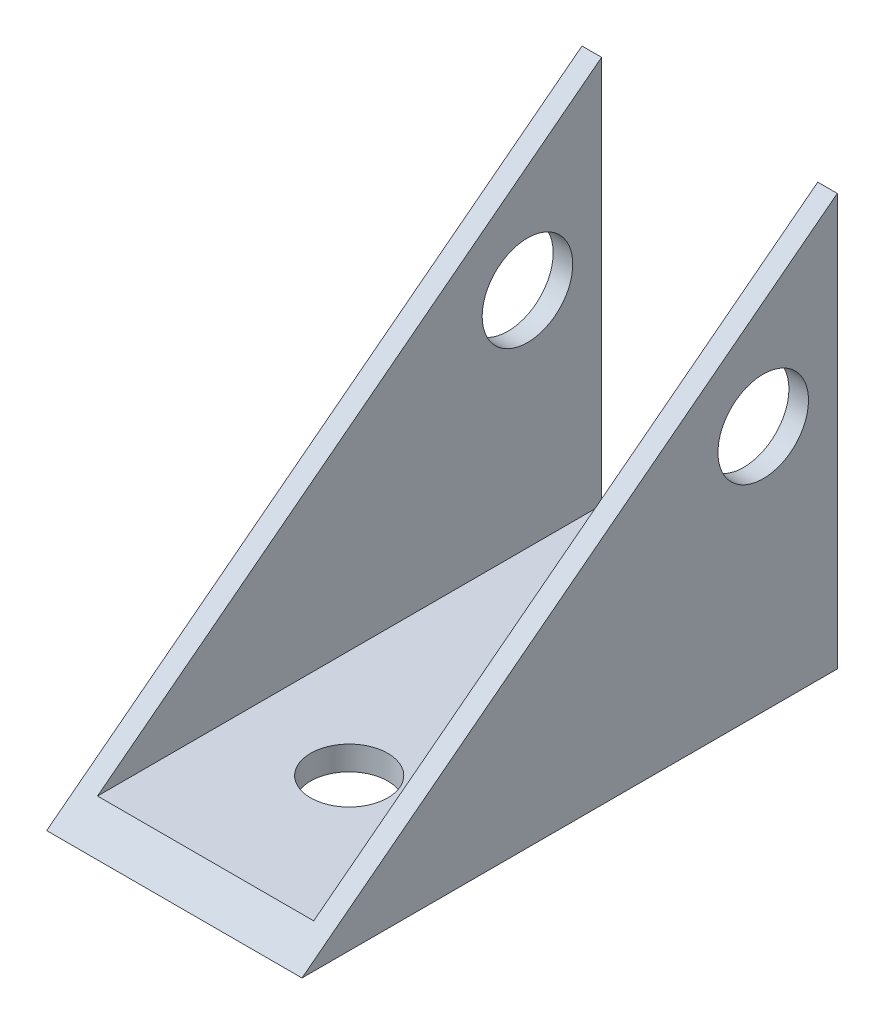
ISO-10303-21;
HEADER;
FILE_DESCRIPTION(('STEP AP214'),'2;1');
FILE_NAME('part.step','',(''),(''),'','','');
FILE_SCHEMA(('AUTOMOTIVE_DESIGN { 1 0 10303 214 1 1 1 1 }'));
ENDSEC;
DATA;
#1=APPLICATION_CONTEXT('core data for automotive mechanical design processes');
#2=APPLICATION_PROTOCOL_DEFINITION('international standard','automotive_design',2000,#1);
#3=PRODUCT_CONTEXT('',#1,'mechanical');
#4=PRODUCT('Part','Part','',(#3));
#5=PRODUCT_RELATED_PRODUCT_CATEGORY('part','',(#4));
#6=PRODUCT_DEFINITION_FORMATION('','',#4);
#7=PRODUCT_DEFINITION_CONTEXT('part definition',#1,'design');
#8=PRODUCT_DEFINITION('design','',#6,#7);
#9=PRODUCT_DEFINITION_SHAPE('','',#8);
#10=(LENGTH_UNIT() NAMED_UNIT(*) SI_UNIT(.MILLI.,.METRE.));
#11=(NAMED_UNIT(*) PLANE_ANGLE_UNIT() SI_UNIT($,.RADIAN.));
#12=(NAMED_UNIT(*) SI_UNIT($,.STERADIAN.) SOLID_ANGLE_UNIT());
#13=UNCERTAINTY_MEASURE_WITH_UNIT(LENGTH_MEASURE(1.E-05),#10,'distance_accuracy_value','');
#14=(GEOMETRIC_REPRESENTATION_CONTEXT(3) GLOBAL_UNCERTAINTY_ASSIGNED_CONTEXT((#13)) GLOBAL_UNIT_ASSIGNED_CONTEXT((#10,
#11,#12)) REPRESENTATION_CONTEXT('',''));
#15=CARTESIAN_POINT('',(0.,0.,0.));
#16=DIRECTION('',(0.,0.,1.));
#17=DIRECTION('',(1.,0.,0.));
#18=AXIS2_PLACEMENT_3D('',#15,#16,#17);
#19=CARTESIAN_POINT('',(31.,0.,-65.));
#20=DIRECTION('',(0.,0.,1.));
#21=DIRECTION('',(1.,0.,0.));
#22=AXIS2_PLACEMENT_3D('',#19,#20,#21);
#23=PLANE('',#22);
#24=DIRECTION('',(-1.,0.,0.));
#25=VECTOR('',#24,1.);
#26=CARTESIAN_POINT('',(31.,0.,-65.));
#27=LINE('',#26,#25);
#28=CARTESIAN_POINT('',(31.,0.,-65.));
#29=VERTEX_POINT('',#28);
#30=CARTESIAN_POINT('',(18.6018252427184,0.,-65.));
#31=VERTEX_POINT('',#30);
#32=EDGE_CURVE('E196',#29,#31,#27,.T.);
#33=ORIENTED_EDGE('',*,*,#32,.T.);
#34=DIRECTION('',(0.,1.,0.));
#35=VECTOR('',#34,1.);
#36=CARTESIAN_POINT('',(18.6018252427184,0.,-65.));
#37=LINE('',#36,#35);
#38=CARTESIAN_POINT('',(18.6018252427184,2.92184358247974,-65.));
#39=VERTEX_POINT('',#38);
#40=EDGE_CURVE('E145',#31,#39,#37,.T.);
#41=ORIENTED_EDGE('',*,*,#40,.T.);
#42=DIRECTION('',(-1.,0.,0.));
#43=VECTOR('',#42,1.);
#44=CARTESIAN_POINT('',(28.6237275333127,2.92184358247974,-65.));
#45=LINE('',#44,#43);
#46=CARTESIAN_POINT('',(28.6237275333127,2.92184358247974,-65.));
#47=VERTEX_POINT('',#46);
#48=EDGE_CURVE('E148',#47,#39,#45,.T.);
#49=ORIENTED_EDGE('',*,*,#48,.F.);
#50=DIRECTION('',(0.,-1.,0.));
#51=VECTOR('',#50,1.);
#52=CARTESIAN_POINT('',(28.6237275333127,2.92184358247974,-65.));
#53=LINE('',#52,#51);
#54=CARTESIAN_POINT('',(28.6237275333127,50.,-65.));
#55=VERTEX_POINT('',#54);
#56=EDGE_CURVE('E153',#55,#47,#53,.T.);
#57=ORIENTED_EDGE('',*,*,#56,.F.);
#58=DIRECTION('',(-1.,0.,0.));
#59=VECTOR('',#58,1.);
#60=CARTESIAN_POINT('',(31.,50.,-65.));
#61=LINE('',#60,#59);
#62=CARTESIAN_POINT('',(31.,50.,-65.));
#63=VERTEX_POINT('',#62);
#64=EDGE_CURVE('E193',#63,#55,#61,.T.);
#65=ORIENTED_EDGE('',*,*,#64,.F.);
#66=DIRECTION('',(0.,1.,0.));
#67=VECTOR('',#66,1.);
#68=CARTESIAN_POINT('',(31.,0.,-65.));
#69=LINE('',#68,#67);
#70=EDGE_CURVE('E184',#29,#63,#69,.T.);
#71=ORIENTED_EDGE('',*,*,#70,.F.);
#72=EDGE_LOOP('',(#33,#41,#49,#57,#65,#71));
#73=FACE_BOUND('',#72,.T.);
#74=ADVANCED_FACE('F33',(#73),#23,.F.);
#75=CARTESIAN_POINT('',(31.,30.,-56.));
#76=DIRECTION('',(-1.,0.,0.));
#77=DIRECTION('',(0.,0.,1.));
#78=AXIS2_PLACEMENT_3D('',#75,#76,#77);
#79=CYLINDRICAL_SURFACE('',#78,5.5);
#80=CARTESIAN_POINT('',(28.6237275333127,30.,-56.));
#81=DIRECTION('',(1.,0.,0.));
#82=DIRECTION('',(0.,0.,-1.));
#83=AXIS2_PLACEMENT_3D('',#80,#81,#82);
#84=CIRCLE('',#83,5.5);
#85=CARTESIAN_POINT('',(28.6237275333127,30.,-61.5));
#86=VERTEX_POINT('',#85);
#87=EDGE_CURVE('E164',#86,#86,#84,.T.);
#88=ORIENTED_EDGE('',*,*,#87,.F.);
#89=EDGE_LOOP('',(#88));
#90=FACE_BOUND('',#89,.T.);
#91=CARTESIAN_POINT('',(31.,30.,-56.));
#92=DIRECTION('',(1.,0.,0.));
#93=DIRECTION('',(0.,0.,-1.));
#94=AXIS2_PLACEMENT_3D('',#91,#92,#93);
#95=CIRCLE('',#94,5.5);
#96=CARTESIAN_POINT('',(31.,30.,-61.5));
#97=VERTEX_POINT('',#96);
#98=EDGE_CURVE('E172',#97,#97,#95,.T.);
#99=ORIENTED_EDGE('',*,*,#98,.T.);
#100=EDGE_LOOP('',(#99));
#101=FACE_BOUND('',#100,.T.);
#102=ADVANCED_FACE('F208',(#90,#101),#79,.F.);
#103=CARTESIAN_POINT('',(31.,0.,0.));
#104=DIRECTION('',(-1.,0.,0.));
#105=DIRECTION('',(0.,0.,1.));
#106=AXIS2_PLACEMENT_3D('',#103,#104,#105);
#107=PLANE('',#106);
#108=DIRECTION('',(0.,-0.609710760849692,0.7926239891046));
#109=VECTOR('',#108,1.);
#110=CARTESIAN_POINT('',(31.,50.,-65.));
#111=LINE('',#110,#109);
#112=CARTESIAN_POINT('',(31.,0.,0.));
#113=VERTEX_POINT('',#112);
#114=EDGE_CURVE('E178',#63,#113,#111,.T.);
#115=ORIENTED_EDGE('',*,*,#114,.T.);
#116=DIRECTION('',(0.,0.,-1.));
#117=VECTOR('',#116,1.);
#118=CARTESIAN_POINT('',(31.,0.,0.));
#119=LINE('',#118,#117);
#120=EDGE_CURVE('E181',#113,#29,#119,.T.);
#121=ORIENTED_EDGE('',*,*,#120,.T.);
#122=ORIENTED_EDGE('',*,*,#70,.T.);
#123=EDGE_LOOP('',(#115,#121,#122));
#124=FACE_BOUND('',#123,.T.);
#125=ORIENTED_EDGE('',*,*,#98,.F.);
#126=EDGE_LOOP('',(#125));
#127=FACE_BOUND('',#126,.T.);
#128=ADVANCED_FACE('F211',(#124,#127),#107,.F.);
#129=CARTESIAN_POINT('',(0.,0.,0.));
#130=DIRECTION('',(-1.,0.,0.));
#131=DIRECTION('',(0.,0.,1.));
#132=AXIS2_PLACEMENT_3D('',#129,#130,#131);
#133=PLANE('',#132);
#134=DIRECTION('',(0.,-0.609710760849692,0.7926239891046));
#135=VECTOR('',#134,1.);
#136=CARTESIAN_POINT('',(0.,50.,-65.));
#137=LINE('',#136,#135);
#138=CARTESIAN_POINT('',(0.,50.,-65.));
#139=VERTEX_POINT('',#138);
#140=CARTESIAN_POINT('',(0.,0.,0.));
#141=VERTEX_POINT('',#140);
#142=EDGE_CURVE('E175',#139,#141,#137,.T.);
#143=ORIENTED_EDGE('',*,*,#142,.F.);
#144=DIRECTION('',(0.,1.,0.));
#145=VECTOR('',#144,1.);
#146=CARTESIAN_POINT('',(0.,0.,-65.));
#147=LINE('',#146,#145);
#148=CARTESIAN_POINT('',(0.,0.,-65.));
#149=VERTEX_POINT('',#148);
#150=EDGE_CURVE('E182',#149,#139,#147,.T.);
#151=ORIENTED_EDGE('',*,*,#150,.F.);
#152=DIRECTION('',(0.,0.,-1.));
#153=VECTOR('',#152,1.);
#154=CARTESIAN_POINT('',(0.,0.,0.));
#155=LINE('',#154,#153);
#156=EDGE_CURVE('E189',#141,#149,#155,.T.);
#157=ORIENTED_EDGE('',*,*,#156,.F.);
#158=EDGE_LOOP('',(#143,#151,#157));
#159=FACE_BOUND('',#158,.T.);
#160=CARTESIAN_POINT('',(0.,30.,-56.));
#161=DIRECTION('',(1.,0.,0.));
#162=DIRECTION('',(0.,0.,-1.));
#163=AXIS2_PLACEMENT_3D('',#160,#161,#162);
#164=CIRCLE('',#163,5.5);
#165=CARTESIAN_POINT('',(0.,30.,-61.5));
#166=VERTEX_POINT('',#165);
#167=EDGE_CURVE('E171',#166,#166,#164,.T.);
#168=ORIENTED_EDGE('',*,*,#167,.T.);
#169=EDGE_LOOP('',(#168));
#170=FACE_BOUND('',#169,.T.);
#171=ADVANCED_FACE('F217',(#159,#170),#133,.T.);
#172=CARTESIAN_POINT('',(31.,50.,-65.));
#173=DIRECTION('',(0.,-0.7926239891046,-0.609710760849692));
#174=DIRECTION('',(0.,0.609710760849692,-0.7926239891046));
#175=AXIS2_PLACEMENT_3D('',#172,#173,#174);
#176=PLANE('',#175);
#177=ORIENTED_EDGE('',*,*,#64,.T.);
#178=DIRECTION('',(0.,-0.609710760849692,0.7926239891046));
#179=VECTOR('',#178,1.);
#180=CARTESIAN_POINT('',(28.6237275333127,50.,-65.));
#181=LINE('',#180,#179);
#182=CARTESIAN_POINT('',(28.6237275333127,2.92184358247972,-3.79839665722362));
#183=VERTEX_POINT('',#182);
#184=EDGE_CURVE('E165',#55,#183,#181,.T.);
#185=ORIENTED_EDGE('',*,*,#184,.T.);
#186=DIRECTION('',(-1.,0.,0.));
#187=VECTOR('',#186,1.);
#188=CARTESIAN_POINT('',(31.,2.92184358247974,-3.79839665722366));
#189=LINE('',#188,#187);
#190=CARTESIAN_POINT('',(2.37627246668733,2.92184358247973,-3.79839665722362));
#191=VERTEX_POINT('',#190);
#192=EDGE_CURVE('E168',#183,#191,#189,.T.);
#193=ORIENTED_EDGE('',*,*,#192,.T.);
#194=DIRECTION('',(0.,0.609710760849692,-0.7926239891046));
#195=VECTOR('',#194,1.);
#196=CARTESIAN_POINT('',(2.37627246668733,50.,-65.));
#197=LINE('',#196,#195);
#198=CARTESIAN_POINT('',(2.37627246668733,50.,-65.));
#199=VERTEX_POINT('',#198);
#200=EDGE_CURVE('E161',#191,#199,#197,.T.);
#201=ORIENTED_EDGE('',*,*,#200,.T.);
#202=EDGE_CURVE('E186',#199,#139,#61,.T.);
#203=ORIENTED_EDGE('',*,*,#202,.T.);
#204=ORIENTED_EDGE('',*,*,#142,.T.);
#205=DIRECTION('',(-1.,0.,0.));
#206=VECTOR('',#205,1.);
#207=CARTESIAN_POINT('',(31.,0.,0.));
#208=LINE('',#207,#206);
#209=EDGE_CURVE('E41',#113,#141,#208,.T.);
#210=ORIENTED_EDGE('',*,*,#209,.F.);
#211=ORIENTED_EDGE('',*,*,#114,.F.);
#212=EDGE_LOOP('',(#177,#185,#193,#201,#203,#204,#210,#211));
#213=FACE_BOUND('',#212,.T.);
#214=ADVANCED_FACE('F35',(#213),#176,.F.);
#215=CARTESIAN_POINT('',(31.,0.,0.));
#216=DIRECTION('',(0.,1.,0.));
#217=DIRECTION('',(0.,0.,1.));
#218=AXIS2_PLACEMENT_3D('',#215,#216,#217);
#219=PLANE('',#218);
#220=CARTESIAN_POINT('',(15.5,0.,-21.2300349514561));
#221=DIRECTION('',(0.,1.,0.));
#222=DIRECTION('',(-1.,0.,0.));
#223=AXIS2_PLACEMENT_3D('',#220,#221,#222);
#224=CIRCLE('',#223,4.68821614779096);
#225=CARTESIAN_POINT('',(10.811783852209,0.,-21.2300349514561));
#226=VERTEX_POINT('',#225);
#227=EDGE_CURVE('E136',#226,#226,#224,.T.);
#228=ORIENTED_EDGE('',*,*,#227,.T.);
#229=EDGE_LOOP('',(#228));
#230=FACE_BOUND('',#229,.T.);
#231=CARTESIAN_POINT('',(15.5,0.,-60.9333980582523));
#232=DIRECTION('',(0.,1.,0.));
#233=DIRECTION('',(-1.,0.,0.));
#234=AXIS2_PLACEMENT_3D('',#231,#232,#233);
#235=CIRCLE('',#234,3.10182524271845);
#236=CARTESIAN_POINT('',(12.3981747572815,0.,-60.9333980582523));
#237=VERTEX_POINT('',#236);
#238=CARTESIAN_POINT('',(18.6018252427184,0.,-60.9333980582523));
#239=VERTEX_POINT('',#238);
#240=EDGE_CURVE('E120',#237,#239,#235,.T.);
#241=ORIENTED_EDGE('',*,*,#240,.T.);
#242=DIRECTION('',(0.,0.,-1.));
#243=VECTOR('',#242,1.);
#244=CARTESIAN_POINT('',(18.6018252427184,0.,-76.649312621359));
#245=LINE('',#244,#243);
#246=EDGE_CURVE('E117',#239,#31,#245,.T.);
#247=ORIENTED_EDGE('',*,*,#246,.T.);
#248=ORIENTED_EDGE('',*,*,#32,.F.);
#249=ORIENTED_EDGE('',*,*,#120,.F.);
#250=ORIENTED_EDGE('',*,*,#209,.T.);
#251=ORIENTED_EDGE('',*,*,#156,.T.);
#252=CARTESIAN_POINT('',(12.3981747572815,0.,-65.));
#253=VERTEX_POINT('',#252);
#254=EDGE_CURVE('E129',#253,#149,#27,.T.);
#255=ORIENTED_EDGE('',*,*,#254,.F.);
#256=DIRECTION('',(0.,0.,1.));
#257=VECTOR('',#256,1.);
#258=CARTESIAN_POINT('',(12.3981747572815,0.,-76.649312621359));
#259=LINE('',#258,#257);
#260=EDGE_CURVE('E112',#253,#237,#259,.T.);
#261=ORIENTED_EDGE('',*,*,#260,.T.);
#262=EDGE_LOOP('',(#241,#247,#248,#249,#250,#251,#255,#261));
#263=FACE_BOUND('',#262,.T.);
#264=ADVANCED_FACE('F127',(#230,#263),#219,.F.);
#265=CARTESIAN_POINT('',(12.3981747572815,2.92184358247974,-65.));
#266=VERTEX_POINT('',#265);
#267=CARTESIAN_POINT('',(2.37627246668733,2.92184358247974,-65.));
#268=VERTEX_POINT('',#267);
#269=EDGE_CURVE('E54',#266,#268,#45,.T.);
#270=ORIENTED_EDGE('',*,*,#269,.F.);
#271=DIRECTION('',(0.,-1.,0.));
#272=VECTOR('',#271,1.);
#273=CARTESIAN_POINT('',(12.3981747572815,0.,-65.));
#274=LINE('',#273,#272);
#275=EDGE_CURVE('E48',#266,#253,#274,.T.);
#276=ORIENTED_EDGE('',*,*,#275,.T.);
#277=ORIENTED_EDGE('',*,*,#254,.T.);
#278=ORIENTED_EDGE('',*,*,#150,.T.);
#279=ORIENTED_EDGE('',*,*,#202,.F.);
#280=DIRECTION('',(0.,1.,0.));
#281=VECTOR('',#280,1.);
#282=CARTESIAN_POINT('',(2.37627246668733,2.92184358247974,-65.));
#283=LINE('',#282,#281);
#284=EDGE_CURVE('E151',#268,#199,#283,.T.);
#285=ORIENTED_EDGE('',*,*,#284,.F.);
#286=EDGE_LOOP('',(#270,#276,#277,#278,#279,#285));
#287=FACE_BOUND('',#286,.T.);
#288=ADVANCED_FACE('F228',(#287),#23,.F.);
#289=CARTESIAN_POINT('',(2.37627246668733,30.,-56.));
#290=DIRECTION('',(-1.,0.,0.));
#291=DIRECTION('',(0.,0.,1.));
#292=AXIS2_PLACEMENT_3D('',#289,#290,#291);
#293=CIRCLE('',#292,5.5);
#294=CARTESIAN_POINT('',(2.37627246668733,30.,-50.5));
#295=VERTEX_POINT('',#294);
#296=EDGE_CURVE('E159',#295,#295,#293,.T.);
#297=ORIENTED_EDGE('',*,*,#296,.F.);
#298=EDGE_LOOP('',(#297));
#299=FACE_BOUND('',#298,.T.);
#300=ORIENTED_EDGE('',*,*,#167,.F.);
#301=EDGE_LOOP('',(#300));
#302=FACE_BOUND('',#301,.T.);
#303=ADVANCED_FACE('F213',(#299,#302),#79,.F.);
#304=CARTESIAN_POINT('',(28.6237275333127,2.92184358247974,0.));
#305=DIRECTION('',(0.,-1.,0.));
#306=DIRECTION('',(1.,0.,0.));
#307=AXIS2_PLACEMENT_3D('',#304,#305,#306);
#308=PLANE('',#307);
#309=CARTESIAN_POINT('',(15.5,2.92184358247974,-21.2300349514561));
#310=DIRECTION('',(0.,1.,0.));
#311=DIRECTION('',(-1.,0.,0.));
#312=AXIS2_PLACEMENT_3D('',#309,#310,#311);
#313=CIRCLE('',#312,4.68821614779096);
#314=CARTESIAN_POINT('',(10.811783852209,2.92184358247974,-21.2300349514561));
#315=VERTEX_POINT('',#314);
#316=EDGE_CURVE('E141',#315,#315,#313,.T.);
#317=ORIENTED_EDGE('',*,*,#316,.F.);
#318=EDGE_LOOP('',(#317));
#319=FACE_BOUND('',#318,.T.);
#320=ORIENTED_EDGE('',*,*,#48,.T.);
#321=DIRECTION('',(0.,0.,-1.));
#322=VECTOR('',#321,1.);
#323=CARTESIAN_POINT('',(18.6018252427184,2.92184358247974,-76.649312621359));
#324=LINE('',#323,#322);
#325=CARTESIAN_POINT('',(18.6018252427184,2.92184358247974,-60.9333980582523));
#326=VERTEX_POINT('',#325);
#327=EDGE_CURVE('E130',#326,#39,#324,.T.);
#328=ORIENTED_EDGE('',*,*,#327,.F.);
#329=CARTESIAN_POINT('',(15.5,2.92184358247974,-60.9333980582523));
#330=DIRECTION('',(0.,1.,0.));
#331=DIRECTION('',(-1.,0.,0.));
#332=AXIS2_PLACEMENT_3D('',#329,#330,#331);
#333=CIRCLE('',#332,3.10182524271845);
#334=CARTESIAN_POINT('',(12.3981747572815,2.92184358247974,-60.9333980582523));
#335=VERTEX_POINT('',#334);
#336=EDGE_CURVE('E132',#335,#326,#333,.T.);
#337=ORIENTED_EDGE('',*,*,#336,.F.);
#338=DIRECTION('',(0.,0.,-1.));
#339=VECTOR('',#338,1.);
#340=CARTESIAN_POINT('',(12.3981747572815,2.92184358247974,0.));
#341=LINE('',#340,#339);
#342=EDGE_CURVE('E11',#335,#266,#341,.T.);
#343=ORIENTED_EDGE('',*,*,#342,.T.);
#344=ORIENTED_EDGE('',*,*,#269,.T.);
#345=DIRECTION('',(0.,0.,-1.));
#346=VECTOR('',#345,1.);
#347=CARTESIAN_POINT('',(2.37627246668733,2.92184358247974,0.));
#348=LINE('',#347,#346);
#349=EDGE_CURVE('E156',#191,#268,#348,.T.);
#350=ORIENTED_EDGE('',*,*,#349,.F.);
#351=ORIENTED_EDGE('',*,*,#192,.F.);
#352=DIRECTION('',(0.,0.,-1.));
#353=VECTOR('',#352,1.);
#354=CARTESIAN_POINT('',(28.6237275333127,2.92184358247974,0.));
#355=LINE('',#354,#353);
#356=EDGE_CURVE('E157',#183,#47,#355,.T.);
#357=ORIENTED_EDGE('',*,*,#356,.T.);
#358=EDGE_LOOP('',(#320,#328,#337,#343,#344,#350,#351,#357));
#359=FACE_BOUND('',#358,.T.);
#360=ADVANCED_FACE('F239',(#319,#359),#308,.F.);
#361=CARTESIAN_POINT('',(28.6237275333127,2.92184358247974,0.));
#362=DIRECTION('',(1.,0.,0.));
#363=DIRECTION('',(0.,0.,-1.));
#364=AXIS2_PLACEMENT_3D('',#361,#362,#363);
#365=PLANE('',#364);
#366=ORIENTED_EDGE('',*,*,#87,.T.);
#367=EDGE_LOOP('',(#366));
#368=FACE_BOUND('',#367,.T.);
#369=ORIENTED_EDGE('',*,*,#56,.T.);
#370=ORIENTED_EDGE('',*,*,#356,.F.);
#371=ORIENTED_EDGE('',*,*,#184,.F.);
#372=EDGE_LOOP('',(#369,#370,#371));
#373=FACE_BOUND('',#372,.T.);
#374=ADVANCED_FACE('F205',(#368,#373),#365,.F.);
#375=CARTESIAN_POINT('',(2.37627246668733,2.92184358247974,0.));
#376=DIRECTION('',(-1.,0.,0.));
#377=DIRECTION('',(0.,0.,1.));
#378=AXIS2_PLACEMENT_3D('',#375,#376,#377);
#379=PLANE('',#378);
#380=ORIENTED_EDGE('',*,*,#296,.T.);
#381=EDGE_LOOP('',(#380));
#382=FACE_BOUND('',#381,.T.);
#383=ORIENTED_EDGE('',*,*,#349,.T.);
#384=ORIENTED_EDGE('',*,*,#284,.T.);
#385=ORIENTED_EDGE('',*,*,#200,.F.);
#386=EDGE_LOOP('',(#383,#384,#385));
#387=FACE_BOUND('',#386,.T.);
#388=ADVANCED_FACE('F245',(#382,#387),#379,.F.);
#389=CARTESIAN_POINT('',(15.5,0.,-21.2300349514561));
#390=DIRECTION('',(0.,1.,0.));
#391=DIRECTION('',(-1.,0.,0.));
#392=AXIS2_PLACEMENT_3D('',#389,#390,#391);
#393=CYLINDRICAL_SURFACE('',#392,4.68821614779096);
#394=ORIENTED_EDGE('',*,*,#227,.F.);
#395=EDGE_LOOP('',(#394));
#396=FACE_BOUND('',#395,.T.);
#397=ORIENTED_EDGE('',*,*,#316,.T.);
#398=EDGE_LOOP('',(#397));
#399=FACE_BOUND('',#398,.T.);
#400=ADVANCED_FACE('F264',(#396,#399),#393,.F.);
#401=CARTESIAN_POINT('',(18.6018252427184,0.,-76.649312621359));
#402=DIRECTION('',(1.,0.,0.));
#403=DIRECTION('',(0.,1.,0.));
#404=AXIS2_PLACEMENT_3D('',#401,#402,#403);
#405=PLANE('',#404);
#406=ORIENTED_EDGE('',*,*,#246,.F.);
#407=DIRECTION('',(0.,1.,0.));
#408=VECTOR('',#407,1.);
#409=CARTESIAN_POINT('',(18.6018252427184,0.,-60.9333980582523));
#410=LINE('',#409,#408);
#411=EDGE_CURVE('E116',#239,#326,#410,.T.);
#412=ORIENTED_EDGE('',*,*,#411,.T.);
#413=ORIENTED_EDGE('',*,*,#327,.T.);
#414=ORIENTED_EDGE('',*,*,#40,.F.);
#415=EDGE_LOOP('',(#406,#412,#413,#414));
#416=FACE_BOUND('',#415,.T.);
#417=ADVANCED_FACE('F253',(#416),#405,.F.);
#418=CARTESIAN_POINT('',(12.3981747572815,0.,-76.649312621359));
#419=DIRECTION('',(-1.,0.,0.));
#420=DIRECTION('',(0.,-1.,0.));
#421=AXIS2_PLACEMENT_3D('',#418,#419,#420);
#422=PLANE('',#421);
#423=ORIENTED_EDGE('',*,*,#342,.F.);
#424=DIRECTION('',(0.,1.,0.));
#425=VECTOR('',#424,1.);
#426=CARTESIAN_POINT('',(12.3981747572815,0.,-60.9333980582523));
#427=LINE('',#426,#425);
#428=EDGE_CURVE('E108',#237,#335,#427,.T.);
#429=ORIENTED_EDGE('',*,*,#428,.F.);
#430=ORIENTED_EDGE('',*,*,#260,.F.);
#431=ORIENTED_EDGE('',*,*,#275,.F.);
#432=EDGE_LOOP('',(#423,#429,#430,#431));
#433=FACE_BOUND('',#432,.T.);
#434=ADVANCED_FACE('F110',(#433),#422,.F.);
#435=CARTESIAN_POINT('',(15.5,0.,-60.9333980582523));
#436=DIRECTION('',(0.,1.,0.));
#437=DIRECTION('',(-1.,0.,0.));
#438=AXIS2_PLACEMENT_3D('',#435,#436,#437);
#439=CYLINDRICAL_SURFACE('',#438,3.10182524271845);
#440=ORIENTED_EDGE('',*,*,#336,.T.);
#441=ORIENTED_EDGE('',*,*,#411,.F.);
#442=ORIENTED_EDGE('',*,*,#240,.F.);
#443=ORIENTED_EDGE('',*,*,#428,.T.);
#444=EDGE_LOOP('',(#440,#441,#442,#443));
#445=FACE_BOUND('',#444,.T.);
#446=ADVANCED_FACE('F121',(#445),#439,.F.);
#447=CLOSED_SHELL('',(#74,#102,#128,#171,#214,#264,#288,#303,#360,#374,#388,#400,#417,#434,#446));
#448=MANIFOLD_SOLID_BREP('B2',#447);
#449=ADVANCED_BREP_SHAPE_REPRESENTATION('',(#18,#448),#14);
#450=SHAPE_DEFINITION_REPRESENTATION(#9,#449);
ENDSEC;
END-ISO-10303-21;
